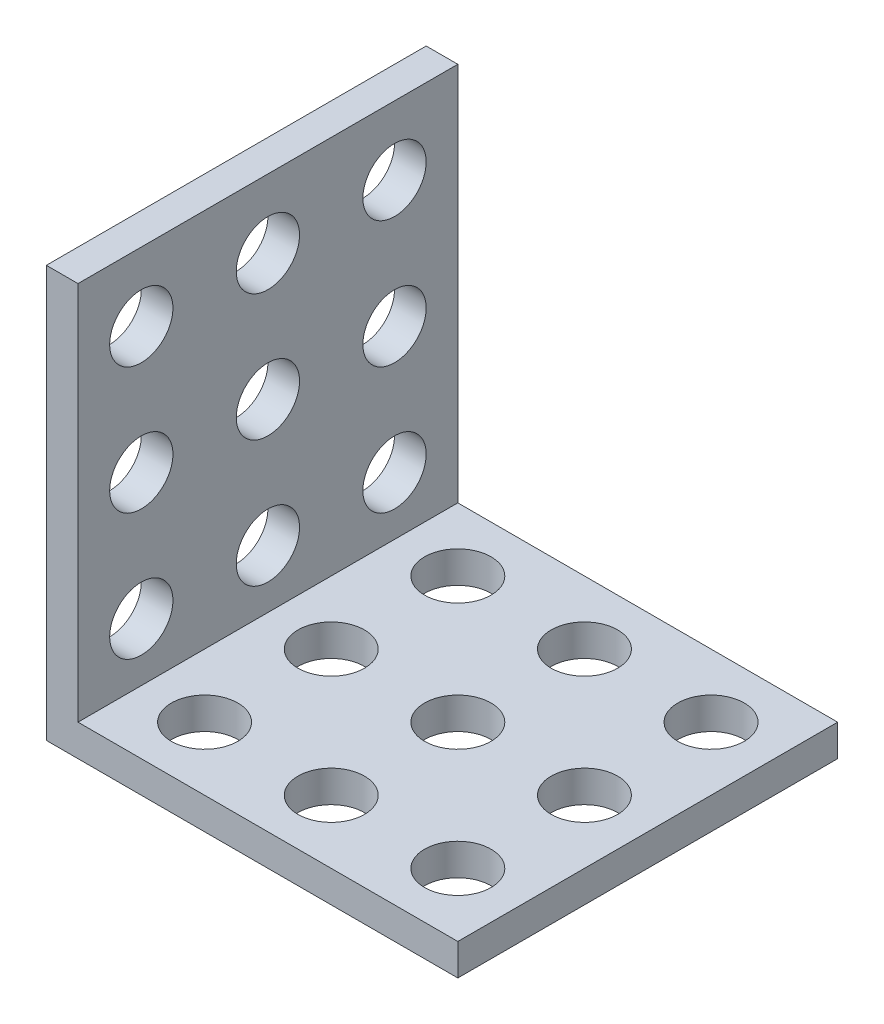
ISO-10303-21;
HEADER;
FILE_DESCRIPTION(('STEP AP214'),'2;1');
FILE_NAME('part.step','',(''),(''),'','','');
FILE_SCHEMA(('AUTOMOTIVE_DESIGN { 1 0 10303 214 1 1 1 1 }'));
ENDSEC;
DATA;
#1=APPLICATION_CONTEXT('core data for automotive mechanical design processes');
#2=APPLICATION_PROTOCOL_DEFINITION('international standard','automotive_design',2000,#1);
#3=PRODUCT_CONTEXT('',#1,'mechanical');
#4=PRODUCT('Part','Part','',(#3));
#5=PRODUCT_RELATED_PRODUCT_CATEGORY('part','',(#4));
#6=PRODUCT_DEFINITION_FORMATION('','',#4);
#7=PRODUCT_DEFINITION_CONTEXT('part definition',#1,'design');
#8=PRODUCT_DEFINITION('design','',#6,#7);
#9=PRODUCT_DEFINITION_SHAPE('','',#8);
#10=(LENGTH_UNIT() NAMED_UNIT(*) SI_UNIT(.MILLI.,.METRE.));
#11=(NAMED_UNIT(*) PLANE_ANGLE_UNIT() SI_UNIT($,.RADIAN.));
#12=(NAMED_UNIT(*) SI_UNIT($,.STERADIAN.) SOLID_ANGLE_UNIT());
#13=UNCERTAINTY_MEASURE_WITH_UNIT(LENGTH_MEASURE(1.E-05),#10,'distance_accuracy_value','');
#14=(GEOMETRIC_REPRESENTATION_CONTEXT(3) GLOBAL_UNCERTAINTY_ASSIGNED_CONTEXT((#13)) GLOBAL_UNIT_ASSIGNED_CONTEXT((#10,
#11,#12)) REPRESENTATION_CONTEXT('',''));
#15=CARTESIAN_POINT('',(0.,0.,0.));
#16=DIRECTION('',(0.,0.,1.));
#17=DIRECTION('',(1.,0.,0.));
#18=AXIS2_PLACEMENT_3D('',#15,#16,#17);
#19=CARTESIAN_POINT('',(0.,2.,0.));
#20=DIRECTION('',(0.,-1.,0.));
#21=DIRECTION('',(0.,0.,-1.));
#22=AXIS2_PLACEMENT_3D('',#19,#20,#21);
#23=PLANE('',#22);
#24=DIRECTION('',(0.,0.,1.));
#25=VECTOR('',#24,1.);
#26=CARTESIAN_POINT('',(0.,2.,12.));
#27=LINE('',#26,#25);
#28=CARTESIAN_POINT('',(0.,2.,-12.));
#29=VERTEX_POINT('',#28);
#30=CARTESIAN_POINT('',(0.,2.,12.));
#31=VERTEX_POINT('',#30);
#32=EDGE_CURVE('E73',#29,#31,#27,.T.);
#33=ORIENTED_EDGE('',*,*,#32,.T.);
#34=DIRECTION('',(1.,0.,0.));
#35=VECTOR('',#34,1.);
#36=CARTESIAN_POINT('',(0.,2.,12.));
#37=LINE('',#36,#35);
#38=CARTESIAN_POINT('',(24.,2.,12.));
#39=VERTEX_POINT('',#38);
#40=EDGE_CURVE('E93',#31,#39,#37,.T.);
#41=ORIENTED_EDGE('',*,*,#40,.T.);
#42=DIRECTION('',(0.,0.,-1.));
#43=VECTOR('',#42,1.);
#44=CARTESIAN_POINT('',(24.,2.,12.));
#45=LINE('',#44,#43);
#46=CARTESIAN_POINT('',(24.,2.,-12.));
#47=VERTEX_POINT('',#46);
#48=EDGE_CURVE('E52',#39,#47,#45,.T.);
#49=ORIENTED_EDGE('',*,*,#48,.T.);
#50=DIRECTION('',(-1.,0.,0.));
#51=VECTOR('',#50,1.);
#52=CARTESIAN_POINT('',(0.,2.,-12.));
#53=LINE('',#52,#51);
#54=EDGE_CURVE('E97',#47,#29,#53,.T.);
#55=ORIENTED_EDGE('',*,*,#54,.T.);
#56=EDGE_LOOP('',(#33,#41,#49,#55));
#57=FACE_BOUND('',#56,.T.);
#58=CARTESIAN_POINT('',(4.,2.,-8.));
#59=DIRECTION('',(0.,1.,0.));
#60=DIRECTION('',(0.,0.,1.));
#61=AXIS2_PLACEMENT_3D('',#58,#59,#60);
#62=CIRCLE('',#61,2.1);
#63=CARTESIAN_POINT('',(4.,2.,-5.9));
#64=VERTEX_POINT('',#63);
#65=EDGE_CURVE('E110',#64,#64,#62,.T.);
#66=ORIENTED_EDGE('',*,*,#65,.F.);
#67=EDGE_LOOP('',(#66));
#68=FACE_BOUND('',#67,.T.);
#69=CARTESIAN_POINT('',(12.,2.,-8.));
#70=DIRECTION('',(0.,1.,0.));
#71=DIRECTION('',(0.,0.,1.));
#72=AXIS2_PLACEMENT_3D('',#69,#70,#71);
#73=CIRCLE('',#72,2.1);
#74=CARTESIAN_POINT('',(12.,2.,-5.9));
#75=VERTEX_POINT('',#74);
#76=EDGE_CURVE('E196',#75,#75,#73,.T.);
#77=ORIENTED_EDGE('',*,*,#76,.F.);
#78=EDGE_LOOP('',(#77));
#79=FACE_BOUND('',#78,.T.);
#80=CARTESIAN_POINT('',(20.,2.,-8.));
#81=DIRECTION('',(0.,1.,0.));
#82=DIRECTION('',(0.,0.,1.));
#83=AXIS2_PLACEMENT_3D('',#80,#81,#82);
#84=CIRCLE('',#83,2.1);
#85=CARTESIAN_POINT('',(20.,2.,-5.9));
#86=VERTEX_POINT('',#85);
#87=EDGE_CURVE('E190',#86,#86,#84,.T.);
#88=ORIENTED_EDGE('',*,*,#87,.F.);
#89=EDGE_LOOP('',(#88));
#90=FACE_BOUND('',#89,.T.);
#91=CARTESIAN_POINT('',(12.0000000000001,2.,0.));
#92=DIRECTION('',(0.,1.,0.));
#93=DIRECTION('',(0.,0.,1.));
#94=AXIS2_PLACEMENT_3D('',#91,#92,#93);
#95=CIRCLE('',#94,2.1);
#96=CARTESIAN_POINT('',(12.0000000000001,2.,2.1));
#97=VERTEX_POINT('',#96);
#98=EDGE_CURVE('E184',#97,#97,#95,.T.);
#99=ORIENTED_EDGE('',*,*,#98,.F.);
#100=EDGE_LOOP('',(#99));
#101=FACE_BOUND('',#100,.T.);
#102=CARTESIAN_POINT('',(20.0000000000001,2.,0.));
#103=DIRECTION('',(0.,1.,0.));
#104=DIRECTION('',(0.,0.,1.));
#105=AXIS2_PLACEMENT_3D('',#102,#103,#104);
#106=CIRCLE('',#105,2.1);
#107=CARTESIAN_POINT('',(20.0000000000001,2.,2.1));
#108=VERTEX_POINT('',#107);
#109=EDGE_CURVE('E178',#108,#108,#106,.T.);
#110=ORIENTED_EDGE('',*,*,#109,.F.);
#111=EDGE_LOOP('',(#110));
#112=FACE_BOUND('',#111,.T.);
#113=CARTESIAN_POINT('',(12.0000000000002,2.,8.));
#114=DIRECTION('',(0.,1.,0.));
#115=DIRECTION('',(0.,0.,1.));
#116=AXIS2_PLACEMENT_3D('',#113,#114,#115);
#117=CIRCLE('',#116,2.1);
#118=CARTESIAN_POINT('',(12.0000000000002,2.,10.1));
#119=VERTEX_POINT('',#118);
#120=EDGE_CURVE('E172',#119,#119,#117,.T.);
#121=ORIENTED_EDGE('',*,*,#120,.F.);
#122=EDGE_LOOP('',(#121));
#123=FACE_BOUND('',#122,.T.);
#124=CARTESIAN_POINT('',(20.0000000000002,2.,8.));
#125=DIRECTION('',(0.,1.,0.));
#126=DIRECTION('',(0.,0.,1.));
#127=AXIS2_PLACEMENT_3D('',#124,#125,#126);
#128=CIRCLE('',#127,2.1);
#129=CARTESIAN_POINT('',(20.0000000000002,2.,10.1));
#130=VERTEX_POINT('',#129);
#131=EDGE_CURVE('E166',#130,#130,#128,.T.);
#132=ORIENTED_EDGE('',*,*,#131,.F.);
#133=EDGE_LOOP('',(#132));
#134=FACE_BOUND('',#133,.T.);
#135=CARTESIAN_POINT('',(4.00000000000009,2.,0.));
#136=DIRECTION('',(0.,1.,0.));
#137=DIRECTION('',(0.,0.,1.));
#138=AXIS2_PLACEMENT_3D('',#135,#136,#137);
#139=CIRCLE('',#138,2.1);
#140=CARTESIAN_POINT('',(4.00000000000009,2.,2.1));
#141=VERTEX_POINT('',#140);
#142=EDGE_CURVE('E160',#141,#141,#139,.T.);
#143=ORIENTED_EDGE('',*,*,#142,.F.);
#144=EDGE_LOOP('',(#143));
#145=FACE_BOUND('',#144,.T.);
#146=CARTESIAN_POINT('',(4.00000000000017,2.,8.));
#147=DIRECTION('',(0.,1.,0.));
#148=DIRECTION('',(0.,0.,1.));
#149=AXIS2_PLACEMENT_3D('',#146,#147,#148);
#150=CIRCLE('',#149,2.1);
#151=CARTESIAN_POINT('',(4.00000000000017,2.,10.1));
#152=VERTEX_POINT('',#151);
#153=EDGE_CURVE('E154',#152,#152,#150,.T.);
#154=ORIENTED_EDGE('',*,*,#153,.F.);
#155=EDGE_LOOP('',(#154));
#156=FACE_BOUND('',#155,.T.);
#157=ADVANCED_FACE('F35',(#57,#68,#79,#90,#101,#112,#123,#134,#145,#156),#23,.F.);
#158=CARTESIAN_POINT('',(0.,0.,0.));
#159=DIRECTION('',(0.,-1.,0.));
#160=DIRECTION('',(0.,0.,-1.));
#161=AXIS2_PLACEMENT_3D('',#158,#159,#160);
#162=PLANE('',#161);
#163=CARTESIAN_POINT('',(4.00000000000009,0.,0.));
#164=DIRECTION('',(0.,1.,0.));
#165=DIRECTION('',(0.,0.,1.));
#166=AXIS2_PLACEMENT_3D('',#163,#164,#165);
#167=CIRCLE('',#166,2.1);
#168=CARTESIAN_POINT('',(4.00000000000009,0.,2.1));
#169=VERTEX_POINT('',#168);
#170=EDGE_CURVE('E157',#169,#169,#167,.T.);
#171=ORIENTED_EDGE('',*,*,#170,.T.);
#172=EDGE_LOOP('',(#171));
#173=FACE_BOUND('',#172,.T.);
#174=CARTESIAN_POINT('',(12.0000000000002,0.,8.));
#175=DIRECTION('',(0.,1.,0.));
#176=DIRECTION('',(0.,0.,1.));
#177=AXIS2_PLACEMENT_3D('',#174,#175,#176);
#178=CIRCLE('',#177,2.1);
#179=CARTESIAN_POINT('',(12.0000000000002,0.,10.1));
#180=VERTEX_POINT('',#179);
#181=EDGE_CURVE('E169',#180,#180,#178,.T.);
#182=ORIENTED_EDGE('',*,*,#181,.T.);
#183=EDGE_LOOP('',(#182));
#184=FACE_BOUND('',#183,.T.);
#185=CARTESIAN_POINT('',(12.0000000000001,0.,0.));
#186=DIRECTION('',(0.,1.,0.));
#187=DIRECTION('',(0.,0.,1.));
#188=AXIS2_PLACEMENT_3D('',#185,#186,#187);
#189=CIRCLE('',#188,2.1);
#190=CARTESIAN_POINT('',(12.0000000000001,0.,2.1));
#191=VERTEX_POINT('',#190);
#192=EDGE_CURVE('E181',#191,#191,#189,.T.);
#193=ORIENTED_EDGE('',*,*,#192,.T.);
#194=EDGE_LOOP('',(#193));
#195=FACE_BOUND('',#194,.T.);
#196=CARTESIAN_POINT('',(12.,0.,-8.));
#197=DIRECTION('',(0.,1.,0.));
#198=DIRECTION('',(0.,0.,1.));
#199=AXIS2_PLACEMENT_3D('',#196,#197,#198);
#200=CIRCLE('',#199,2.1);
#201=CARTESIAN_POINT('',(12.,0.,-5.9));
#202=VERTEX_POINT('',#201);
#203=EDGE_CURVE('E193',#202,#202,#200,.T.);
#204=ORIENTED_EDGE('',*,*,#203,.T.);
#205=EDGE_LOOP('',(#204));
#206=FACE_BOUND('',#205,.T.);
#207=DIRECTION('',(1.,0.,0.));
#208=VECTOR('',#207,1.);
#209=CARTESIAN_POINT('',(0.,0.,12.));
#210=LINE('',#209,#208);
#211=CARTESIAN_POINT('',(-2.,0.,12.));
#212=VERTEX_POINT('',#211);
#213=CARTESIAN_POINT('',(24.,0.,12.));
#214=VERTEX_POINT('',#213);
#215=EDGE_CURVE('E64',#212,#214,#210,.T.);
#216=ORIENTED_EDGE('',*,*,#215,.F.);
#217=DIRECTION('',(0.,0.,1.));
#218=VECTOR('',#217,1.);
#219=CARTESIAN_POINT('',(-2.,0.,-12.));
#220=LINE('',#219,#218);
#221=CARTESIAN_POINT('',(-2.,0.,-12.));
#222=VERTEX_POINT('',#221);
#223=EDGE_CURVE('E124',#222,#212,#220,.T.);
#224=ORIENTED_EDGE('',*,*,#223,.F.);
#225=DIRECTION('',(-1.,0.,0.));
#226=VECTOR('',#225,1.);
#227=CARTESIAN_POINT('',(0.,0.,-12.));
#228=LINE('',#227,#226);
#229=CARTESIAN_POINT('',(24.,0.,-12.));
#230=VERTEX_POINT('',#229);
#231=EDGE_CURVE('E98',#230,#222,#228,.T.);
#232=ORIENTED_EDGE('',*,*,#231,.F.);
#233=DIRECTION('',(0.,0.,-1.));
#234=VECTOR('',#233,1.);
#235=CARTESIAN_POINT('',(24.,0.,12.));
#236=LINE('',#235,#234);
#237=EDGE_CURVE('E101',#214,#230,#236,.T.);
#238=ORIENTED_EDGE('',*,*,#237,.F.);
#239=EDGE_LOOP('',(#216,#224,#232,#238));
#240=FACE_BOUND('',#239,.T.);
#241=CARTESIAN_POINT('',(4.,0.,-8.));
#242=DIRECTION('',(0.,1.,0.));
#243=DIRECTION('',(0.,0.,1.));
#244=AXIS2_PLACEMENT_3D('',#241,#242,#243);
#245=CIRCLE('',#244,2.1);
#246=CARTESIAN_POINT('',(4.,0.,-5.9));
#247=VERTEX_POINT('',#246);
#248=EDGE_CURVE('E104',#247,#247,#245,.T.);
#249=ORIENTED_EDGE('',*,*,#248,.T.);
#250=EDGE_LOOP('',(#249));
#251=FACE_BOUND('',#250,.T.);
#252=CARTESIAN_POINT('',(20.,0.,-8.));
#253=DIRECTION('',(0.,1.,0.));
#254=DIRECTION('',(0.,0.,1.));
#255=AXIS2_PLACEMENT_3D('',#252,#253,#254);
#256=CIRCLE('',#255,2.1);
#257=CARTESIAN_POINT('',(20.,0.,-5.9));
#258=VERTEX_POINT('',#257);
#259=EDGE_CURVE('E187',#258,#258,#256,.T.);
#260=ORIENTED_EDGE('',*,*,#259,.T.);
#261=EDGE_LOOP('',(#260));
#262=FACE_BOUND('',#261,.T.);
#263=CARTESIAN_POINT('',(20.0000000000001,0.,0.));
#264=DIRECTION('',(0.,1.,0.));
#265=DIRECTION('',(0.,0.,1.));
#266=AXIS2_PLACEMENT_3D('',#263,#264,#265);
#267=CIRCLE('',#266,2.1);
#268=CARTESIAN_POINT('',(20.0000000000001,0.,2.1));
#269=VERTEX_POINT('',#268);
#270=EDGE_CURVE('E175',#269,#269,#267,.T.);
#271=ORIENTED_EDGE('',*,*,#270,.T.);
#272=EDGE_LOOP('',(#271));
#273=FACE_BOUND('',#272,.T.);
#274=CARTESIAN_POINT('',(20.0000000000002,0.,8.));
#275=DIRECTION('',(0.,1.,0.));
#276=DIRECTION('',(0.,0.,1.));
#277=AXIS2_PLACEMENT_3D('',#274,#275,#276);
#278=CIRCLE('',#277,2.1);
#279=CARTESIAN_POINT('',(20.0000000000002,0.,10.1));
#280=VERTEX_POINT('',#279);
#281=EDGE_CURVE('E163',#280,#280,#278,.T.);
#282=ORIENTED_EDGE('',*,*,#281,.T.);
#283=EDGE_LOOP('',(#282));
#284=FACE_BOUND('',#283,.T.);
#285=CARTESIAN_POINT('',(4.00000000000017,0.,8.));
#286=DIRECTION('',(0.,1.,0.));
#287=DIRECTION('',(0.,0.,1.));
#288=AXIS2_PLACEMENT_3D('',#285,#286,#287);
#289=CIRCLE('',#288,2.1);
#290=CARTESIAN_POINT('',(4.00000000000017,0.,10.1));
#291=VERTEX_POINT('',#290);
#292=EDGE_CURVE('E153',#291,#291,#289,.T.);
#293=ORIENTED_EDGE('',*,*,#292,.T.);
#294=EDGE_LOOP('',(#293));
#295=FACE_BOUND('',#294,.T.);
#296=ADVANCED_FACE('F121',(#173,#184,#195,#206,#240,#251,#262,#273,#284,#295),#162,.T.);
#297=CARTESIAN_POINT('',(0.,2.,12.));
#298=DIRECTION('',(0.,0.,-1.));
#299=DIRECTION('',(-1.,0.,0.));
#300=AXIS2_PLACEMENT_3D('',#297,#298,#299);
#301=PLANE('',#300);
#302=ORIENTED_EDGE('',*,*,#215,.T.);
#303=DIRECTION('',(0.,-1.,0.));
#304=VECTOR('',#303,1.);
#305=CARTESIAN_POINT('',(24.,2.,12.));
#306=LINE('',#305,#304);
#307=EDGE_CURVE('E11',#39,#214,#306,.T.);
#308=ORIENTED_EDGE('',*,*,#307,.F.);
#309=ORIENTED_EDGE('',*,*,#40,.F.);
#310=DIRECTION('',(0.,1.,0.));
#311=VECTOR('',#310,1.);
#312=CARTESIAN_POINT('',(0.,0.,12.));
#313=LINE('',#312,#311);
#314=CARTESIAN_POINT('',(0.,26.,12.));
#315=VERTEX_POINT('',#314);
#316=EDGE_CURVE('E83',#31,#315,#313,.T.);
#317=ORIENTED_EDGE('',*,*,#316,.T.);
#318=DIRECTION('',(1.,0.,0.));
#319=VECTOR('',#318,1.);
#320=CARTESIAN_POINT('',(-2.,26.,12.));
#321=LINE('',#320,#319);
#322=CARTESIAN_POINT('',(-2.,26.,12.));
#323=VERTEX_POINT('',#322);
#324=EDGE_CURVE('E151',#323,#315,#321,.T.);
#325=ORIENTED_EDGE('',*,*,#324,.F.);
#326=DIRECTION('',(0.,1.,0.));
#327=VECTOR('',#326,1.);
#328=CARTESIAN_POINT('',(-2.,0.,12.));
#329=LINE('',#328,#327);
#330=EDGE_CURVE('E130',#212,#323,#329,.T.);
#331=ORIENTED_EDGE('',*,*,#330,.F.);
#332=EDGE_LOOP('',(#302,#308,#309,#317,#325,#331));
#333=FACE_BOUND('',#332,.T.);
#334=ADVANCED_FACE('F37',(#333),#301,.F.);
#335=CARTESIAN_POINT('',(24.,2.,12.));
#336=DIRECTION('',(-1.,0.,0.));
#337=DIRECTION('',(0.,0.,1.));
#338=AXIS2_PLACEMENT_3D('',#335,#336,#337);
#339=PLANE('',#338);
#340=ORIENTED_EDGE('',*,*,#237,.T.);
#341=DIRECTION('',(0.,-1.,0.));
#342=VECTOR('',#341,1.);
#343=CARTESIAN_POINT('',(24.,2.,-12.));
#344=LINE('',#343,#342);
#345=EDGE_CURVE('E44',#47,#230,#344,.T.);
#346=ORIENTED_EDGE('',*,*,#345,.F.);
#347=ORIENTED_EDGE('',*,*,#48,.F.);
#348=ORIENTED_EDGE('',*,*,#307,.T.);
#349=EDGE_LOOP('',(#340,#346,#347,#348));
#350=FACE_BOUND('',#349,.T.);
#351=ADVANCED_FACE('F218',(#350),#339,.F.);
#352=CARTESIAN_POINT('',(0.,2.,-12.));
#353=DIRECTION('',(0.,0.,1.));
#354=DIRECTION('',(1.,0.,0.));
#355=AXIS2_PLACEMENT_3D('',#352,#353,#354);
#356=PLANE('',#355);
#357=ORIENTED_EDGE('',*,*,#231,.T.);
#358=DIRECTION('',(0.,-1.,0.));
#359=VECTOR('',#358,1.);
#360=CARTESIAN_POINT('',(-2.,0.,-12.));
#361=LINE('',#360,#359);
#362=CARTESIAN_POINT('',(-2.,26.,-12.));
#363=VERTEX_POINT('',#362);
#364=EDGE_CURVE('E131',#363,#222,#361,.T.);
#365=ORIENTED_EDGE('',*,*,#364,.F.);
#366=DIRECTION('',(1.,0.,0.));
#367=VECTOR('',#366,1.);
#368=CARTESIAN_POINT('',(-2.,26.,-12.));
#369=LINE('',#368,#367);
#370=CARTESIAN_POINT('',(0.,26.,-12.));
#371=VERTEX_POINT('',#370);
#372=EDGE_CURVE('E147',#363,#371,#369,.T.);
#373=ORIENTED_EDGE('',*,*,#372,.T.);
#374=DIRECTION('',(0.,-1.,0.));
#375=VECTOR('',#374,1.);
#376=CARTESIAN_POINT('',(0.,0.,-12.));
#377=LINE('',#376,#375);
#378=EDGE_CURVE('E91',#371,#29,#377,.T.);
#379=ORIENTED_EDGE('',*,*,#378,.T.);
#380=ORIENTED_EDGE('',*,*,#54,.F.);
#381=ORIENTED_EDGE('',*,*,#345,.T.);
#382=EDGE_LOOP('',(#357,#365,#373,#379,#380,#381));
#383=FACE_BOUND('',#382,.T.);
#384=ADVANCED_FACE('F114',(#383),#356,.F.);
#385=CARTESIAN_POINT('',(4.,2.,-8.));
#386=DIRECTION('',(0.,-1.,0.));
#387=DIRECTION('',(0.,0.,-1.));
#388=AXIS2_PLACEMENT_3D('',#385,#386,#387);
#389=CYLINDRICAL_SURFACE('',#388,2.1);
#390=ORIENTED_EDGE('',*,*,#65,.T.);
#391=EDGE_LOOP('',(#390));
#392=FACE_BOUND('',#391,.T.);
#393=ORIENTED_EDGE('',*,*,#248,.F.);
#394=EDGE_LOOP('',(#393));
#395=FACE_BOUND('',#394,.T.);
#396=ADVANCED_FACE('F207',(#392,#395),#389,.F.);
#397=CARTESIAN_POINT('',(12.,2.,-8.));
#398=DIRECTION('',(0.,-1.,0.));
#399=DIRECTION('',(0.,0.,-1.));
#400=AXIS2_PLACEMENT_3D('',#397,#398,#399);
#401=CYLINDRICAL_SURFACE('',#400,2.1);
#402=ORIENTED_EDGE('',*,*,#76,.T.);
#403=EDGE_LOOP('',(#402));
#404=FACE_BOUND('',#403,.T.);
#405=ORIENTED_EDGE('',*,*,#203,.F.);
#406=EDGE_LOOP('',(#405));
#407=FACE_BOUND('',#406,.T.);
#408=ADVANCED_FACE('F209',(#404,#407),#401,.F.);
#409=CARTESIAN_POINT('',(20.,2.,-8.));
#410=DIRECTION('',(0.,-1.,0.));
#411=DIRECTION('',(0.,0.,-1.));
#412=AXIS2_PLACEMENT_3D('',#409,#410,#411);
#413=CYLINDRICAL_SURFACE('',#412,2.1);
#414=ORIENTED_EDGE('',*,*,#87,.T.);
#415=EDGE_LOOP('',(#414));
#416=FACE_BOUND('',#415,.T.);
#417=ORIENTED_EDGE('',*,*,#259,.F.);
#418=EDGE_LOOP('',(#417));
#419=FACE_BOUND('',#418,.T.);
#420=ADVANCED_FACE('F215',(#416,#419),#413,.F.);
#421=CARTESIAN_POINT('',(12.0000000000001,2.,0.));
#422=DIRECTION('',(0.,-1.,0.));
#423=DIRECTION('',(0.,0.,-1.));
#424=AXIS2_PLACEMENT_3D('',#421,#422,#423);
#425=CYLINDRICAL_SURFACE('',#424,2.1);
#426=ORIENTED_EDGE('',*,*,#98,.T.);
#427=EDGE_LOOP('',(#426));
#428=FACE_BOUND('',#427,.T.);
#429=ORIENTED_EDGE('',*,*,#192,.F.);
#430=EDGE_LOOP('',(#429));
#431=FACE_BOUND('',#430,.T.);
#432=ADVANCED_FACE('F294',(#428,#431),#425,.F.);
#433=CARTESIAN_POINT('',(20.0000000000001,2.,0.));
#434=DIRECTION('',(0.,-1.,0.));
#435=DIRECTION('',(0.,0.,-1.));
#436=AXIS2_PLACEMENT_3D('',#433,#434,#435);
#437=CYLINDRICAL_SURFACE('',#436,2.1);
#438=ORIENTED_EDGE('',*,*,#109,.T.);
#439=EDGE_LOOP('',(#438));
#440=FACE_BOUND('',#439,.T.);
#441=ORIENTED_EDGE('',*,*,#270,.F.);
#442=EDGE_LOOP('',(#441));
#443=FACE_BOUND('',#442,.T.);
#444=ADVANCED_FACE('F284',(#440,#443),#437,.F.);
#445=CARTESIAN_POINT('',(12.0000000000002,2.,8.));
#446=DIRECTION('',(0.,-1.,0.));
#447=DIRECTION('',(0.,0.,-1.));
#448=AXIS2_PLACEMENT_3D('',#445,#446,#447);
#449=CYLINDRICAL_SURFACE('',#448,2.1);
#450=ORIENTED_EDGE('',*,*,#120,.T.);
#451=EDGE_LOOP('',(#450));
#452=FACE_BOUND('',#451,.T.);
#453=ORIENTED_EDGE('',*,*,#181,.F.);
#454=EDGE_LOOP('',(#453));
#455=FACE_BOUND('',#454,.T.);
#456=ADVANCED_FACE('F274',(#452,#455),#449,.F.);
#457=CARTESIAN_POINT('',(20.0000000000002,2.,8.));
#458=DIRECTION('',(0.,-1.,0.));
#459=DIRECTION('',(0.,0.,-1.));
#460=AXIS2_PLACEMENT_3D('',#457,#458,#459);
#461=CYLINDRICAL_SURFACE('',#460,2.1);
#462=ORIENTED_EDGE('',*,*,#131,.T.);
#463=EDGE_LOOP('',(#462));
#464=FACE_BOUND('',#463,.T.);
#465=ORIENTED_EDGE('',*,*,#281,.F.);
#466=EDGE_LOOP('',(#465));
#467=FACE_BOUND('',#466,.T.);
#468=ADVANCED_FACE('F264',(#464,#467),#461,.F.);
#469=CARTESIAN_POINT('',(4.00000000000009,2.,0.));
#470=DIRECTION('',(0.,-1.,0.));
#471=DIRECTION('',(0.,0.,-1.));
#472=AXIS2_PLACEMENT_3D('',#469,#470,#471);
#473=CYLINDRICAL_SURFACE('',#472,2.1);
#474=ORIENTED_EDGE('',*,*,#142,.T.);
#475=EDGE_LOOP('',(#474));
#476=FACE_BOUND('',#475,.T.);
#477=ORIENTED_EDGE('',*,*,#170,.F.);
#478=EDGE_LOOP('',(#477));
#479=FACE_BOUND('',#478,.T.);
#480=ADVANCED_FACE('F253',(#476,#479),#473,.F.);
#481=CARTESIAN_POINT('',(4.00000000000017,2.,8.));
#482=DIRECTION('',(0.,-1.,0.));
#483=DIRECTION('',(0.,0.,-1.));
#484=AXIS2_PLACEMENT_3D('',#481,#482,#483);
#485=CYLINDRICAL_SURFACE('',#484,2.1);
#486=ORIENTED_EDGE('',*,*,#153,.T.);
#487=EDGE_LOOP('',(#486));
#488=FACE_BOUND('',#487,.T.);
#489=ORIENTED_EDGE('',*,*,#292,.F.);
#490=EDGE_LOOP('',(#489));
#491=FACE_BOUND('',#490,.T.);
#492=ADVANCED_FACE('F249',(#488,#491),#485,.F.);
#493=CARTESIAN_POINT('',(0.,0.,0.));
#494=DIRECTION('',(1.,0.,0.));
#495=DIRECTION('',(0.,0.,-1.));
#496=AXIS2_PLACEMENT_3D('',#493,#494,#495);
#497=PLANE('',#496);
#498=CARTESIAN_POINT('',(0.,5.66666666666667,-7.99999999999983));
#499=DIRECTION('',(-1.,0.,0.));
#500=DIRECTION('',(0.,0.,1.));
#501=AXIS2_PLACEMENT_3D('',#498,#499,#500);
#502=CIRCLE('',#501,2.);
#503=CARTESIAN_POINT('',(0.,5.66666666666667,-5.99999999999983));
#504=VERTEX_POINT('',#503);
#505=EDGE_CURVE('E465',#504,#504,#502,.T.);
#506=ORIENTED_EDGE('',*,*,#505,.T.);
#507=EDGE_LOOP('',(#506));
#508=FACE_BOUND('',#507,.T.);
#509=CARTESIAN_POINT('',(0.,5.66666666666667,8.00000000000017));
#510=DIRECTION('',(-1.,0.,0.));
#511=DIRECTION('',(0.,0.,1.));
#512=AXIS2_PLACEMENT_3D('',#509,#510,#511);
#513=CIRCLE('',#512,2.);
#514=CARTESIAN_POINT('',(0.,5.66666666666667,10.0000000000002));
#515=VERTEX_POINT('',#514);
#516=EDGE_CURVE('E473',#515,#515,#513,.T.);
#517=ORIENTED_EDGE('',*,*,#516,.T.);
#518=EDGE_LOOP('',(#517));
#519=FACE_BOUND('',#518,.T.);
#520=CARTESIAN_POINT('',(0.,13.6666666666667,8.00000000000009));
#521=DIRECTION('',(-1.,0.,0.));
#522=DIRECTION('',(0.,0.,1.));
#523=AXIS2_PLACEMENT_3D('',#520,#521,#522);
#524=CIRCLE('',#523,2.);
#525=CARTESIAN_POINT('',(0.,13.6666666666667,10.0000000000001));
#526=VERTEX_POINT('',#525);
#527=EDGE_CURVE('E485',#526,#526,#524,.T.);
#528=ORIENTED_EDGE('',*,*,#527,.T.);
#529=EDGE_LOOP('',(#528));
#530=FACE_BOUND('',#529,.T.);
#531=CARTESIAN_POINT('',(0.,21.6666666666667,8.));
#532=DIRECTION('',(-1.,0.,0.));
#533=DIRECTION('',(0.,0.,1.));
#534=AXIS2_PLACEMENT_3D('',#531,#532,#533);
#535=CIRCLE('',#534,2.);
#536=CARTESIAN_POINT('',(0.,21.6666666666667,10.));
#537=VERTEX_POINT('',#536);
#538=EDGE_CURVE('E497',#537,#537,#535,.T.);
#539=ORIENTED_EDGE('',*,*,#538,.T.);
#540=EDGE_LOOP('',(#539));
#541=FACE_BOUND('',#540,.T.);
#542=CARTESIAN_POINT('',(0.,21.6666666666667,-8.));
#543=DIRECTION('',(-1.,0.,0.));
#544=DIRECTION('',(0.,0.,1.));
#545=AXIS2_PLACEMENT_3D('',#542,#543,#544);
#546=CIRCLE('',#545,2.);
#547=CARTESIAN_POINT('',(0.,21.6666666666667,-6.));
#548=VERTEX_POINT('',#547);
#549=EDGE_CURVE('E142',#548,#548,#546,.T.);
#550=ORIENTED_EDGE('',*,*,#549,.T.);
#551=EDGE_LOOP('',(#550));
#552=FACE_BOUND('',#551,.T.);
#553=CARTESIAN_POINT('',(0.,21.6666666666667,0.));
#554=DIRECTION('',(-1.,0.,0.));
#555=DIRECTION('',(0.,0.,1.));
#556=AXIS2_PLACEMENT_3D('',#553,#554,#555);
#557=CIRCLE('',#556,2.);
#558=CARTESIAN_POINT('',(0.,21.6666666666667,2.));
#559=VERTEX_POINT('',#558);
#560=EDGE_CURVE('E503',#559,#559,#557,.T.);
#561=ORIENTED_EDGE('',*,*,#560,.T.);
#562=EDGE_LOOP('',(#561));
#563=FACE_BOUND('',#562,.T.);
#564=CARTESIAN_POINT('',(0.,13.6666666666667,0.));
#565=DIRECTION('',(-1.,0.,0.));
#566=DIRECTION('',(0.,0.,1.));
#567=AXIS2_PLACEMENT_3D('',#564,#565,#566);
#568=CIRCLE('',#567,2.);
#569=CARTESIAN_POINT('',(0.,13.6666666666667,2.00000000000009));
#570=VERTEX_POINT('',#569);
#571=EDGE_CURVE('E491',#570,#570,#568,.T.);
#572=ORIENTED_EDGE('',*,*,#571,.T.);
#573=EDGE_LOOP('',(#572));
#574=FACE_BOUND('',#573,.T.);
#575=CARTESIAN_POINT('',(0.,5.66666666666667,1.6826817716975E-13));
#576=DIRECTION('',(-1.,0.,0.));
#577=DIRECTION('',(0.,0.,1.));
#578=AXIS2_PLACEMENT_3D('',#575,#576,#577);
#579=CIRCLE('',#578,2.);
#580=CARTESIAN_POINT('',(0.,5.66666666666667,2.00000000000017));
#581=VERTEX_POINT('',#580);
#582=EDGE_CURVE('E479',#581,#581,#579,.T.);
#583=ORIENTED_EDGE('',*,*,#582,.T.);
#584=EDGE_LOOP('',(#583));
#585=FACE_BOUND('',#584,.T.);
#586=CARTESIAN_POINT('',(0.,13.6666666666667,-7.99999999999991));
#587=DIRECTION('',(-1.,0.,0.));
#588=DIRECTION('',(0.,0.,1.));
#589=AXIS2_PLACEMENT_3D('',#586,#587,#588);
#590=CIRCLE('',#589,2.);
#591=CARTESIAN_POINT('',(0.,13.6666666666667,-5.99999999999991));
#592=VERTEX_POINT('',#591);
#593=EDGE_CURVE('E467',#592,#592,#590,.T.);
#594=ORIENTED_EDGE('',*,*,#593,.T.);
#595=EDGE_LOOP('',(#594));
#596=FACE_BOUND('',#595,.T.);
#597=ORIENTED_EDGE('',*,*,#32,.F.);
#598=ORIENTED_EDGE('',*,*,#378,.F.);
#599=DIRECTION('',(0.,0.,-1.));
#600=VECTOR('',#599,1.);
#601=CARTESIAN_POINT('',(0.,26.,-12.));
#602=LINE('',#601,#600);
#603=EDGE_CURVE('E88',#315,#371,#602,.T.);
#604=ORIENTED_EDGE('',*,*,#603,.F.);
#605=ORIENTED_EDGE('',*,*,#316,.F.);
#606=EDGE_LOOP('',(#597,#598,#604,#605));
#607=FACE_BOUND('',#606,.T.);
#608=ADVANCED_FACE('F85',(#508,#519,#530,#541,#552,#563,#574,#585,#596,#607),#497,.T.);
#609=CARTESIAN_POINT('',(-2.,0.,0.));
#610=DIRECTION('',(1.,0.,0.));
#611=DIRECTION('',(0.,0.,-1.));
#612=AXIS2_PLACEMENT_3D('',#609,#610,#611);
#613=PLANE('',#612);
#614=ORIENTED_EDGE('',*,*,#364,.T.);
#615=ORIENTED_EDGE('',*,*,#223,.T.);
#616=ORIENTED_EDGE('',*,*,#330,.T.);
#617=DIRECTION('',(0.,0.,-1.));
#618=VECTOR('',#617,1.);
#619=CARTESIAN_POINT('',(-2.,26.,-12.));
#620=LINE('',#619,#618);
#621=EDGE_CURVE('E136',#323,#363,#620,.T.);
#622=ORIENTED_EDGE('',*,*,#621,.T.);
#623=EDGE_LOOP('',(#614,#615,#616,#622));
#624=FACE_BOUND('',#623,.T.);
#625=CARTESIAN_POINT('',(-2.,21.6666666666667,-8.));
#626=DIRECTION('',(-1.,0.,0.));
#627=DIRECTION('',(0.,0.,1.));
#628=AXIS2_PLACEMENT_3D('',#625,#626,#627);
#629=CIRCLE('',#628,2.);
#630=CARTESIAN_POINT('',(-2.,21.6666666666667,-6.));
#631=VERTEX_POINT('',#630);
#632=EDGE_CURVE('E148',#631,#631,#629,.T.);
#633=ORIENTED_EDGE('',*,*,#632,.F.);
#634=EDGE_LOOP('',(#633));
#635=FACE_BOUND('',#634,.T.);
#636=CARTESIAN_POINT('',(-2.,21.6666666666667,0.));
#637=DIRECTION('',(-1.,0.,0.));
#638=DIRECTION('',(0.,0.,1.));
#639=AXIS2_PLACEMENT_3D('',#636,#637,#638);
#640=CIRCLE('',#639,2.);
#641=CARTESIAN_POINT('',(-2.,21.6666666666667,2.));
#642=VERTEX_POINT('',#641);
#643=EDGE_CURVE('E506',#642,#642,#640,.T.);
#644=ORIENTED_EDGE('',*,*,#643,.F.);
#645=EDGE_LOOP('',(#644));
#646=FACE_BOUND('',#645,.T.);
#647=CARTESIAN_POINT('',(-2.,21.6666666666667,8.));
#648=DIRECTION('',(-1.,0.,0.));
#649=DIRECTION('',(0.,0.,1.));
#650=AXIS2_PLACEMENT_3D('',#647,#648,#649);
#651=CIRCLE('',#650,2.);
#652=CARTESIAN_POINT('',(-2.,21.6666666666667,10.));
#653=VERTEX_POINT('',#652);
#654=EDGE_CURVE('E500',#653,#653,#651,.T.);
#655=ORIENTED_EDGE('',*,*,#654,.F.);
#656=EDGE_LOOP('',(#655));
#657=FACE_BOUND('',#656,.T.);
#658=CARTESIAN_POINT('',(-2.,13.6666666666667,0.));
#659=DIRECTION('',(-1.,0.,0.));
#660=DIRECTION('',(0.,0.,1.));
#661=AXIS2_PLACEMENT_3D('',#658,#659,#660);
#662=CIRCLE('',#661,2.);
#663=CARTESIAN_POINT('',(-2.,13.6666666666667,2.00000000000009));
#664=VERTEX_POINT('',#663);
#665=EDGE_CURVE('E494',#664,#664,#662,.T.);
#666=ORIENTED_EDGE('',*,*,#665,.F.);
#667=EDGE_LOOP('',(#666));
#668=FACE_BOUND('',#667,.T.);
#669=CARTESIAN_POINT('',(-2.,13.6666666666667,8.00000000000009));
#670=DIRECTION('',(-1.,0.,0.));
#671=DIRECTION('',(0.,0.,1.));
#672=AXIS2_PLACEMENT_3D('',#669,#670,#671);
#673=CIRCLE('',#672,2.);
#674=CARTESIAN_POINT('',(-2.,13.6666666666667,10.0000000000001));
#675=VERTEX_POINT('',#674);
#676=EDGE_CURVE('E488',#675,#675,#673,.T.);
#677=ORIENTED_EDGE('',*,*,#676,.F.);
#678=EDGE_LOOP('',(#677));
#679=FACE_BOUND('',#678,.T.);
#680=CARTESIAN_POINT('',(-2.,5.66666666666667,1.6826817716975E-13));
#681=DIRECTION('',(-1.,0.,0.));
#682=DIRECTION('',(0.,0.,1.));
#683=AXIS2_PLACEMENT_3D('',#680,#681,#682);
#684=CIRCLE('',#683,2.);
#685=CARTESIAN_POINT('',(-2.,5.66666666666667,2.00000000000017));
#686=VERTEX_POINT('',#685);
#687=EDGE_CURVE('E482',#686,#686,#684,.T.);
#688=ORIENTED_EDGE('',*,*,#687,.F.);
#689=EDGE_LOOP('',(#688));
#690=FACE_BOUND('',#689,.T.);
#691=CARTESIAN_POINT('',(-2.,5.66666666666667,8.00000000000017));
#692=DIRECTION('',(-1.,0.,0.));
#693=DIRECTION('',(0.,0.,1.));
#694=AXIS2_PLACEMENT_3D('',#691,#692,#693);
#695=CIRCLE('',#694,2.);
#696=CARTESIAN_POINT('',(-2.,5.66666666666667,10.0000000000002));
#697=VERTEX_POINT('',#696);
#698=EDGE_CURVE('E476',#697,#697,#695,.T.);
#699=ORIENTED_EDGE('',*,*,#698,.F.);
#700=EDGE_LOOP('',(#699));
#701=FACE_BOUND('',#700,.T.);
#702=CARTESIAN_POINT('',(-2.,13.6666666666667,-7.99999999999991));
#703=DIRECTION('',(-1.,0.,0.));
#704=DIRECTION('',(0.,0.,1.));
#705=AXIS2_PLACEMENT_3D('',#702,#703,#704);
#706=CIRCLE('',#705,2.);
#707=CARTESIAN_POINT('',(-2.,13.6666666666667,-5.99999999999991));
#708=VERTEX_POINT('',#707);
#709=EDGE_CURVE('E470',#708,#708,#706,.T.);
#710=ORIENTED_EDGE('',*,*,#709,.F.);
#711=EDGE_LOOP('',(#710));
#712=FACE_BOUND('',#711,.T.);
#713=CARTESIAN_POINT('',(-2.,5.66666666666667,-7.99999999999983));
#714=DIRECTION('',(-1.,0.,0.));
#715=DIRECTION('',(0.,0.,1.));
#716=AXIS2_PLACEMENT_3D('',#713,#714,#715);
#717=CIRCLE('',#716,2.);
#718=CARTESIAN_POINT('',(-2.,5.66666666666667,-5.99999999999983));
#719=VERTEX_POINT('',#718);
#720=EDGE_CURVE('E462',#719,#719,#717,.T.);
#721=ORIENTED_EDGE('',*,*,#720,.F.);
#722=EDGE_LOOP('',(#721));
#723=FACE_BOUND('',#722,.T.);
#724=ADVANCED_FACE('F133',(#624,#635,#646,#657,#668,#679,#690,#701,#712,#723),#613,.F.);
#725=CARTESIAN_POINT('',(-2.,26.,-12.));
#726=DIRECTION('',(0.,-1.,0.));
#727=DIRECTION('',(0.,0.,-1.));
#728=AXIS2_PLACEMENT_3D('',#725,#726,#727);
#729=PLANE('',#728);
#730=ORIENTED_EDGE('',*,*,#603,.T.);
#731=ORIENTED_EDGE('',*,*,#372,.F.);
#732=ORIENTED_EDGE('',*,*,#621,.F.);
#733=ORIENTED_EDGE('',*,*,#324,.T.);
#734=EDGE_LOOP('',(#730,#731,#732,#733));
#735=FACE_BOUND('',#734,.T.);
#736=ADVANCED_FACE('F356',(#735),#729,.F.);
#737=CARTESIAN_POINT('',(-2.,21.6666666666667,-8.));
#738=DIRECTION('',(1.,0.,0.));
#739=DIRECTION('',(0.,0.,-1.));
#740=AXIS2_PLACEMENT_3D('',#737,#738,#739);
#741=CYLINDRICAL_SURFACE('',#740,2.);
#742=ORIENTED_EDGE('',*,*,#632,.T.);
#743=EDGE_LOOP('',(#742));
#744=FACE_BOUND('',#743,.T.);
#745=ORIENTED_EDGE('',*,*,#549,.F.);
#746=EDGE_LOOP('',(#745));
#747=FACE_BOUND('',#746,.T.);
#748=ADVANCED_FACE('F364',(#744,#747),#741,.F.);
#749=CARTESIAN_POINT('',(-2.,21.6666666666667,0.));
#750=DIRECTION('',(1.,0.,0.));
#751=DIRECTION('',(0.,0.,-1.));
#752=AXIS2_PLACEMENT_3D('',#749,#750,#751);
#753=CYLINDRICAL_SURFACE('',#752,2.);
#754=ORIENTED_EDGE('',*,*,#643,.T.);
#755=EDGE_LOOP('',(#754));
#756=FACE_BOUND('',#755,.T.);
#757=ORIENTED_EDGE('',*,*,#560,.F.);
#758=EDGE_LOOP('',(#757));
#759=FACE_BOUND('',#758,.T.);
#760=ADVANCED_FACE('F373',(#756,#759),#753,.F.);
#761=CARTESIAN_POINT('',(-2.,21.6666666666667,8.));
#762=DIRECTION('',(1.,0.,0.));
#763=DIRECTION('',(0.,0.,-1.));
#764=AXIS2_PLACEMENT_3D('',#761,#762,#763);
#765=CYLINDRICAL_SURFACE('',#764,2.);
#766=ORIENTED_EDGE('',*,*,#654,.T.);
#767=EDGE_LOOP('',(#766));
#768=FACE_BOUND('',#767,.T.);
#769=ORIENTED_EDGE('',*,*,#538,.F.);
#770=EDGE_LOOP('',(#769));
#771=FACE_BOUND('',#770,.T.);
#772=ADVANCED_FACE('F382',(#768,#771),#765,.F.);
#773=CARTESIAN_POINT('',(-2.,13.6666666666667,0.));
#774=DIRECTION('',(1.,0.,0.));
#775=DIRECTION('',(0.,0.,-1.));
#776=AXIS2_PLACEMENT_3D('',#773,#774,#775);
#777=CYLINDRICAL_SURFACE('',#776,2.);
#778=ORIENTED_EDGE('',*,*,#665,.T.);
#779=EDGE_LOOP('',(#778));
#780=FACE_BOUND('',#779,.T.);
#781=ORIENTED_EDGE('',*,*,#571,.F.);
#782=EDGE_LOOP('',(#781));
#783=FACE_BOUND('',#782,.T.);
#784=ADVANCED_FACE('F391',(#780,#783),#777,.F.);
#785=CARTESIAN_POINT('',(-2.,13.6666666666667,8.00000000000009));
#786=DIRECTION('',(1.,0.,0.));
#787=DIRECTION('',(0.,0.,-1.));
#788=AXIS2_PLACEMENT_3D('',#785,#786,#787);
#789=CYLINDRICAL_SURFACE('',#788,2.);
#790=ORIENTED_EDGE('',*,*,#676,.T.);
#791=EDGE_LOOP('',(#790));
#792=FACE_BOUND('',#791,.T.);
#793=ORIENTED_EDGE('',*,*,#527,.F.);
#794=EDGE_LOOP('',(#793));
#795=FACE_BOUND('',#794,.T.);
#796=ADVANCED_FACE('F400',(#792,#795),#789,.F.);
#797=CARTESIAN_POINT('',(-2.,5.66666666666667,1.6826817716975E-13));
#798=DIRECTION('',(1.,0.,0.));
#799=DIRECTION('',(0.,0.,-1.));
#800=AXIS2_PLACEMENT_3D('',#797,#798,#799);
#801=CYLINDRICAL_SURFACE('',#800,2.);
#802=ORIENTED_EDGE('',*,*,#687,.T.);
#803=EDGE_LOOP('',(#802));
#804=FACE_BOUND('',#803,.T.);
#805=ORIENTED_EDGE('',*,*,#582,.F.);
#806=EDGE_LOOP('',(#805));
#807=FACE_BOUND('',#806,.T.);
#808=ADVANCED_FACE('F409',(#804,#807),#801,.F.);
#809=CARTESIAN_POINT('',(-2.,5.66666666666667,8.00000000000017));
#810=DIRECTION('',(1.,0.,0.));
#811=DIRECTION('',(0.,0.,-1.));
#812=AXIS2_PLACEMENT_3D('',#809,#810,#811);
#813=CYLINDRICAL_SURFACE('',#812,2.);
#814=ORIENTED_EDGE('',*,*,#698,.T.);
#815=EDGE_LOOP('',(#814));
#816=FACE_BOUND('',#815,.T.);
#817=ORIENTED_EDGE('',*,*,#516,.F.);
#818=EDGE_LOOP('',(#817));
#819=FACE_BOUND('',#818,.T.);
#820=ADVANCED_FACE('F418',(#816,#819),#813,.F.);
#821=CARTESIAN_POINT('',(-2.,13.6666666666667,-7.99999999999991));
#822=DIRECTION('',(1.,0.,0.));
#823=DIRECTION('',(0.,0.,-1.));
#824=AXIS2_PLACEMENT_3D('',#821,#822,#823);
#825=CYLINDRICAL_SURFACE('',#824,2.);
#826=ORIENTED_EDGE('',*,*,#709,.T.);
#827=EDGE_LOOP('',(#826));
#828=FACE_BOUND('',#827,.T.);
#829=ORIENTED_EDGE('',*,*,#593,.F.);
#830=EDGE_LOOP('',(#829));
#831=FACE_BOUND('',#830,.T.);
#832=ADVANCED_FACE('F427',(#828,#831),#825,.F.);
#833=CARTESIAN_POINT('',(-2.,5.66666666666667,-7.99999999999983));
#834=DIRECTION('',(1.,0.,0.));
#835=DIRECTION('',(0.,0.,-1.));
#836=AXIS2_PLACEMENT_3D('',#833,#834,#835);
#837=CYLINDRICAL_SURFACE('',#836,2.);
#838=ORIENTED_EDGE('',*,*,#720,.T.);
#839=EDGE_LOOP('',(#838));
#840=FACE_BOUND('',#839,.T.);
#841=ORIENTED_EDGE('',*,*,#505,.F.);
#842=EDGE_LOOP('',(#841));
#843=FACE_BOUND('',#842,.T.);
#844=ADVANCED_FACE('F436',(#840,#843),#837,.F.);
#845=CLOSED_SHELL('',(#157,#296,#334,#351,#384,#396,#408,#420,#432,#444,#456,#468,#480,#492,
#608,#724,#736,#748,#760,#772,#784,#796,#808,#820,#832,#844));
#846=MANIFOLD_SOLID_BREP('B2',#845);
#847=ADVANCED_BREP_SHAPE_REPRESENTATION('',(#18,#846),#14);
#848=SHAPE_DEFINITION_REPRESENTATION(#9,#847);
ENDSEC;
END-ISO-10303-21;
